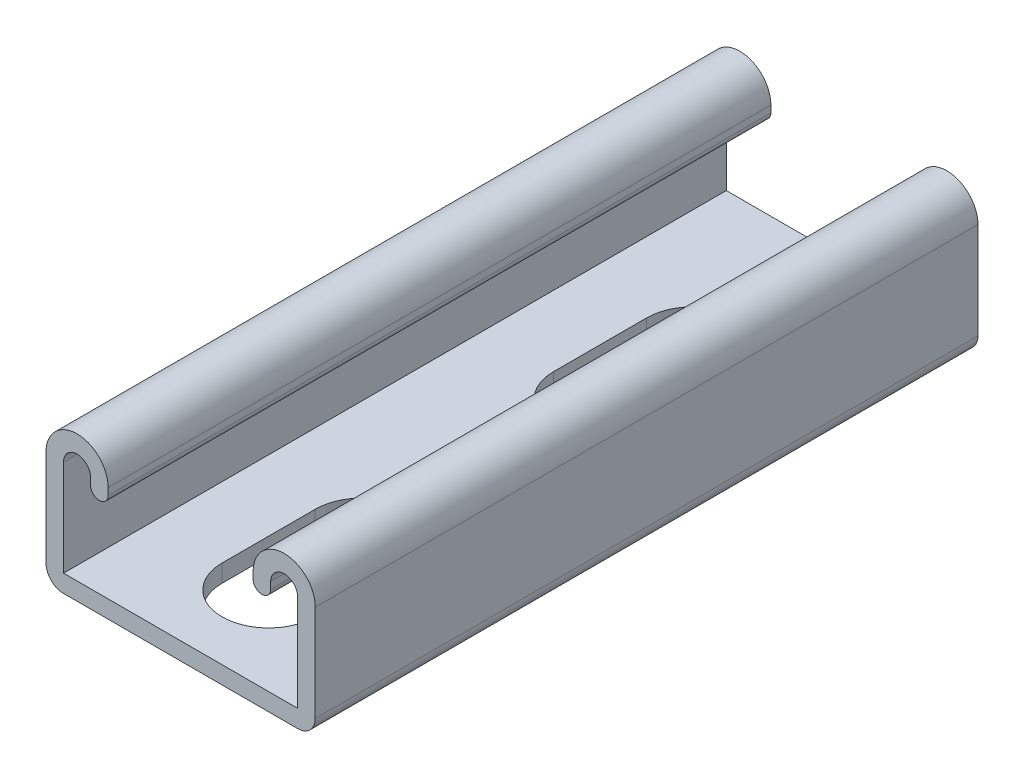
ISO-10303-21;
HEADER;
FILE_DESCRIPTION(('STEP AP214'),'2;1');
FILE_NAME('part.step','',(''),(''),'','','');
FILE_SCHEMA(('AUTOMOTIVE_DESIGN { 1 0 10303 214 1 1 1 1 }'));
ENDSEC;
DATA;
#1=APPLICATION_CONTEXT('core data for automotive mechanical design processes');
#2=APPLICATION_PROTOCOL_DEFINITION('international standard','automotive_design',2000,#1);
#3=PRODUCT_CONTEXT('',#1,'mechanical');
#4=PRODUCT('Part','Part','',(#3));
#5=PRODUCT_RELATED_PRODUCT_CATEGORY('part','',(#4));
#6=PRODUCT_DEFINITION_FORMATION('','',#4);
#7=PRODUCT_DEFINITION_CONTEXT('part definition',#1,'design');
#8=PRODUCT_DEFINITION('design','',#6,#7);
#9=PRODUCT_DEFINITION_SHAPE('','',#8);
#10=(LENGTH_UNIT() NAMED_UNIT(*) SI_UNIT(.MILLI.,.METRE.));
#11=(NAMED_UNIT(*) PLANE_ANGLE_UNIT() SI_UNIT($,.RADIAN.));
#12=(NAMED_UNIT(*) SI_UNIT($,.STERADIAN.) SOLID_ANGLE_UNIT());
#13=UNCERTAINTY_MEASURE_WITH_UNIT(LENGTH_MEASURE(1.E-05),#10,'distance_accuracy_value','');
#14=(GEOMETRIC_REPRESENTATION_CONTEXT(3) GLOBAL_UNCERTAINTY_ASSIGNED_CONTEXT((#13)) GLOBAL_UNIT_ASSIGNED_CONTEXT((#10,
#11,#12)) REPRESENTATION_CONTEXT('',''));
#15=CARTESIAN_POINT('',(0.,0.,0.));
#16=DIRECTION('',(0.,0.,1.));
#17=DIRECTION('',(1.,0.,0.));
#18=AXIS2_PLACEMENT_3D('',#15,#16,#17);
#19=CARTESIAN_POINT('',(-15.875,8.3693,101.6));
#20=DIRECTION('',(0.,0.,-1.));
#21=DIRECTION('',(-1.,0.,0.));
#22=AXIS2_PLACEMENT_3D('',#19,#20,#21);
#23=CYLINDRICAL_SURFACE('',#22,4.7625);
#24=CARTESIAN_POINT('',(-15.875,8.3693,0.));
#25=DIRECTION('',(0.,0.,1.));
#26=DIRECTION('',(-1.,0.,0.));
#27=AXIS2_PLACEMENT_3D('',#24,#25,#26);
#28=CIRCLE('',#27,4.7625);
#29=CARTESIAN_POINT('',(-11.1125,8.3693,0.));
#30=VERTEX_POINT('',#29);
#31=CARTESIAN_POINT('',(-20.6375,8.3693,0.));
#32=VERTEX_POINT('',#31);
#33=EDGE_CURVE('E253',#30,#32,#28,.T.);
#34=ORIENTED_EDGE('',*,*,#33,.T.);
#35=DIRECTION('',(0.,0.,-1.));
#36=VECTOR('',#35,1.);
#37=CARTESIAN_POINT('',(-20.6375,8.3693,101.6));
#38=LINE('',#37,#36);
#39=CARTESIAN_POINT('',(-20.6375,8.3693,101.6));
#40=VERTEX_POINT('',#39);
#41=EDGE_CURVE('E384',#40,#32,#38,.T.);
#42=ORIENTED_EDGE('',*,*,#41,.F.);
#43=CARTESIAN_POINT('',(-15.875,8.3693,101.6));
#44=DIRECTION('',(0.,0.,1.));
#45=DIRECTION('',(-1.,0.,0.));
#46=AXIS2_PLACEMENT_3D('',#43,#44,#45);
#47=CIRCLE('',#46,4.7625);
#48=CARTESIAN_POINT('',(-11.1125,8.3693,101.6));
#49=VERTEX_POINT('',#48);
#50=EDGE_CURVE('E260',#49,#40,#47,.T.);
#51=ORIENTED_EDGE('',*,*,#50,.F.);
#52=DIRECTION('',(0.,0.,-1.));
#53=VECTOR('',#52,1.);
#54=CARTESIAN_POINT('',(-11.1125,8.3693,101.6));
#55=LINE('',#54,#53);
#56=EDGE_CURVE('E298',#49,#30,#55,.T.);
#57=ORIENTED_EDGE('',*,*,#56,.T.);
#58=EDGE_LOOP('',(#34,#42,#51,#57));
#59=FACE_BOUND('',#58,.T.);
#60=ADVANCED_FACE('F32',(#59),#23,.T.);
#61=CARTESIAN_POINT('',(-20.6375,8.3693,101.6));
#62=DIRECTION('',(1.,0.,0.));
#63=DIRECTION('',(0.,1.,0.));
#64=AXIS2_PLACEMENT_3D('',#61,#62,#63);
#65=PLANE('',#64);
#66=DIRECTION('',(0.,-1.,0.));
#67=VECTOR('',#66,1.);
#68=CARTESIAN_POINT('',(-20.6375,8.3693,0.));
#69=LINE('',#68,#67);
#70=CARTESIAN_POINT('',(-20.6375,-6.4008,0.));
#71=VERTEX_POINT('',#70);
#72=EDGE_CURVE('E301',#32,#71,#69,.T.);
#73=ORIENTED_EDGE('',*,*,#72,.T.);
#74=DIRECTION('',(0.,0.,-1.));
#75=VECTOR('',#74,1.);
#76=CARTESIAN_POINT('',(-20.6375,-6.4008,101.6));
#77=LINE('',#76,#75);
#78=CARTESIAN_POINT('',(-20.6375,-6.4008,101.6));
#79=VERTEX_POINT('',#78);
#80=EDGE_CURVE('E381',#79,#71,#77,.T.);
#81=ORIENTED_EDGE('',*,*,#80,.F.);
#82=DIRECTION('',(0.,-1.,0.));
#83=VECTOR('',#82,1.);
#84=CARTESIAN_POINT('',(-20.6375,8.3693,101.6));
#85=LINE('',#84,#83);
#86=EDGE_CURVE('E263',#40,#79,#85,.T.);
#87=ORIENTED_EDGE('',*,*,#86,.F.);
#88=ORIENTED_EDGE('',*,*,#41,.T.);
#89=EDGE_LOOP('',(#73,#81,#87,#88));
#90=FACE_BOUND('',#89,.T.);
#91=ADVANCED_FACE('F425',(#90),#65,.F.);
#92=CARTESIAN_POINT('',(-17.9451,-6.4008,101.6));
#93=DIRECTION('',(0.,0.,-1.));
#94=DIRECTION('',(-1.,0.,0.));
#95=AXIS2_PLACEMENT_3D('',#92,#93,#94);
#96=CYLINDRICAL_SURFACE('',#95,2.6924);
#97=CARTESIAN_POINT('',(-17.9451,-6.4008,0.));
#98=DIRECTION('',(0.,0.,1.));
#99=DIRECTION('',(-1.,0.,0.));
#100=AXIS2_PLACEMENT_3D('',#97,#98,#99);
#101=CIRCLE('',#100,2.6924);
#102=CARTESIAN_POINT('',(-17.9451,-9.0932,0.));
#103=VERTEX_POINT('',#102);
#104=EDGE_CURVE('E303',#71,#103,#101,.T.);
#105=ORIENTED_EDGE('',*,*,#104,.T.);
#106=DIRECTION('',(0.,0.,-1.));
#107=VECTOR('',#106,1.);
#108=CARTESIAN_POINT('',(-17.9451,-9.0932,101.6));
#109=LINE('',#108,#107);
#110=CARTESIAN_POINT('',(-17.9451,-9.0932,101.6));
#111=VERTEX_POINT('',#110);
#112=EDGE_CURVE('E378',#111,#103,#109,.T.);
#113=ORIENTED_EDGE('',*,*,#112,.F.);
#114=CARTESIAN_POINT('',(-17.9451,-6.4008,101.6));
#115=DIRECTION('',(0.,0.,1.));
#116=DIRECTION('',(-1.,0.,0.));
#117=AXIS2_PLACEMENT_3D('',#114,#115,#116);
#118=CIRCLE('',#117,2.6924);
#119=EDGE_CURVE('E266',#79,#111,#118,.T.);
#120=ORIENTED_EDGE('',*,*,#119,.F.);
#121=ORIENTED_EDGE('',*,*,#80,.T.);
#122=EDGE_LOOP('',(#105,#113,#120,#121));
#123=FACE_BOUND('',#122,.T.);
#124=ADVANCED_FACE('F430',(#123),#96,.T.);
#125=CARTESIAN_POINT('',(-17.9451,-9.0932,101.6));
#126=DIRECTION('',(0.,1.,0.));
#127=DIRECTION('',(0.,0.,1.));
#128=AXIS2_PLACEMENT_3D('',#125,#126,#127);
#129=PLANE('',#128);
#130=DIRECTION('',(0.,0.,-1.));
#131=VECTOR('',#130,1.);
#132=CARTESIAN_POINT('',(-7.14375,-9.09319999999525,73.81875));
#133=LINE('',#132,#131);
#134=CARTESIAN_POINT('',(-7.14375,-9.0932,88.10625));
#135=VERTEX_POINT('',#134);
#136=CARTESIAN_POINT('',(-7.14375,-9.09319999999525,73.81875));
#137=VERTEX_POINT('',#136);
#138=EDGE_CURVE('E206',#135,#137,#133,.T.);
#139=ORIENTED_EDGE('',*,*,#138,.F.);
#140=CARTESIAN_POINT('',(0.,-9.09319999999525,88.10625));
#141=DIRECTION('',(0.,-1.,0.));
#142=DIRECTION('',(0.,0.,-1.));
#143=AXIS2_PLACEMENT_3D('',#140,#141,#142);
#144=CIRCLE('',#143,7.14375);
#145=CARTESIAN_POINT('',(7.14375,-9.09319999999525,88.10625));
#146=VERTEX_POINT('',#145);
#147=EDGE_CURVE('E46',#146,#135,#144,.T.);
#148=ORIENTED_EDGE('',*,*,#147,.F.);
#149=DIRECTION('',(0.,0.,1.));
#150=VECTOR('',#149,1.);
#151=CARTESIAN_POINT('',(7.14375,-9.09319999999525,88.10625));
#152=LINE('',#151,#150);
#153=CARTESIAN_POINT('',(7.14375,-9.09319999999525,73.81875));
#154=VERTEX_POINT('',#153);
#155=EDGE_CURVE('E222',#154,#146,#152,.T.);
#156=ORIENTED_EDGE('',*,*,#155,.F.);
#157=CARTESIAN_POINT('',(0.,-9.09319999999525,73.81875));
#158=DIRECTION('',(0.,-1.,0.));
#159=DIRECTION('',(0.,0.,-1.));
#160=AXIS2_PLACEMENT_3D('',#157,#158,#159);
#161=CIRCLE('',#160,7.14375);
#162=EDGE_CURVE('E216',#137,#154,#161,.T.);
#163=ORIENTED_EDGE('',*,*,#162,.F.);
#164=EDGE_LOOP('',(#139,#148,#156,#163));
#165=FACE_BOUND('',#164,.T.);
#166=DIRECTION('',(0.,0.,-1.));
#167=VECTOR('',#166,1.);
#168=CARTESIAN_POINT('',(-7.14375,-9.09319999999525,23.01875));
#169=LINE('',#168,#167);
#170=CARTESIAN_POINT('',(-7.14375,-9.0932,37.30625));
#171=VERTEX_POINT('',#170);
#172=CARTESIAN_POINT('',(-7.14375,-9.09319999999525,23.01875));
#173=VERTEX_POINT('',#172);
#174=EDGE_CURVE('E241',#171,#173,#169,.T.);
#175=ORIENTED_EDGE('',*,*,#174,.F.);
#176=CARTESIAN_POINT('',(0.,-9.09319999999525,37.30625));
#177=DIRECTION('',(0.,-1.,0.));
#178=DIRECTION('',(0.,0.,-1.));
#179=AXIS2_PLACEMENT_3D('',#176,#177,#178);
#180=CIRCLE('',#179,7.14375);
#181=CARTESIAN_POINT('',(7.14375,-9.09319999999525,37.30625));
#182=VERTEX_POINT('',#181);
#183=EDGE_CURVE('E239',#182,#171,#180,.T.);
#184=ORIENTED_EDGE('',*,*,#183,.F.);
#185=DIRECTION('',(0.,0.,1.));
#186=VECTOR('',#185,1.);
#187=CARTESIAN_POINT('',(7.14375,-9.09319999999525,37.30625));
#188=LINE('',#187,#186);
#189=CARTESIAN_POINT('',(7.14375,-9.09319999999525,23.01875));
#190=VERTEX_POINT('',#189);
#191=EDGE_CURVE('E247',#190,#182,#188,.T.);
#192=ORIENTED_EDGE('',*,*,#191,.F.);
#193=CARTESIAN_POINT('',(0.,-9.09319999999525,23.01875));
#194=DIRECTION('',(0.,-1.,0.));
#195=DIRECTION('',(0.,0.,-1.));
#196=AXIS2_PLACEMENT_3D('',#193,#194,#195);
#197=CIRCLE('',#196,7.14375);
#198=EDGE_CURVE('E244',#173,#190,#197,.T.);
#199=ORIENTED_EDGE('',*,*,#198,.F.);
#200=EDGE_LOOP('',(#175,#184,#192,#199));
#201=FACE_BOUND('',#200,.T.);
#202=DIRECTION('',(1.,0.,0.));
#203=VECTOR('',#202,1.);
#204=CARTESIAN_POINT('',(-17.9451,-9.0932,0.));
#205=LINE('',#204,#203);
#206=CARTESIAN_POINT('',(17.9451,-9.0932,0.));
#207=VERTEX_POINT('',#206);
#208=EDGE_CURVE('E305',#103,#207,#205,.T.);
#209=ORIENTED_EDGE('',*,*,#208,.T.);
#210=DIRECTION('',(0.,0.,-1.));
#211=VECTOR('',#210,1.);
#212=CARTESIAN_POINT('',(17.9451,-9.0932,101.6));
#213=LINE('',#212,#211);
#214=CARTESIAN_POINT('',(17.9451,-9.0932,101.6));
#215=VERTEX_POINT('',#214);
#216=EDGE_CURVE('E375',#215,#207,#213,.T.);
#217=ORIENTED_EDGE('',*,*,#216,.F.);
#218=DIRECTION('',(1.,0.,0.));
#219=VECTOR('',#218,1.);
#220=CARTESIAN_POINT('',(-17.9451,-9.0932,101.6));
#221=LINE('',#220,#219);
#222=EDGE_CURVE('E268',#111,#215,#221,.T.);
#223=ORIENTED_EDGE('',*,*,#222,.F.);
#224=ORIENTED_EDGE('',*,*,#112,.T.);
#225=EDGE_LOOP('',(#209,#217,#223,#224));
#226=FACE_BOUND('',#225,.T.);
#227=ADVANCED_FACE('F220',(#165,#201,#226),#129,.F.);
#228=CARTESIAN_POINT('',(17.9451,-6.4008,101.6));
#229=DIRECTION('',(0.,0.,-1.));
#230=DIRECTION('',(-1.,0.,0.));
#231=AXIS2_PLACEMENT_3D('',#228,#229,#230);
#232=CYLINDRICAL_SURFACE('',#231,2.6924);
#233=CARTESIAN_POINT('',(17.9451,-6.4008,0.));
#234=DIRECTION('',(0.,0.,1.));
#235=DIRECTION('',(1.,0.,0.));
#236=AXIS2_PLACEMENT_3D('',#233,#234,#235);
#237=CIRCLE('',#236,2.6924);
#238=CARTESIAN_POINT('',(20.6375,-6.4008,0.));
#239=VERTEX_POINT('',#238);
#240=EDGE_CURVE('E307',#207,#239,#237,.T.);
#241=ORIENTED_EDGE('',*,*,#240,.T.);
#242=DIRECTION('',(0.,0.,-1.));
#243=VECTOR('',#242,1.);
#244=CARTESIAN_POINT('',(20.6375,-6.4008,101.6));
#245=LINE('',#244,#243);
#246=CARTESIAN_POINT('',(20.6375,-6.4008,101.6));
#247=VERTEX_POINT('',#246);
#248=EDGE_CURVE('E372',#247,#239,#245,.T.);
#249=ORIENTED_EDGE('',*,*,#248,.F.);
#250=CARTESIAN_POINT('',(17.9451,-6.4008,101.6));
#251=DIRECTION('',(0.,0.,1.));
#252=DIRECTION('',(1.,0.,0.));
#253=AXIS2_PLACEMENT_3D('',#250,#251,#252);
#254=CIRCLE('',#253,2.6924);
#255=EDGE_CURVE('E270',#215,#247,#254,.T.);
#256=ORIENTED_EDGE('',*,*,#255,.F.);
#257=ORIENTED_EDGE('',*,*,#216,.T.);
#258=EDGE_LOOP('',(#241,#249,#256,#257));
#259=FACE_BOUND('',#258,.T.);
#260=ADVANCED_FACE('F510',(#259),#232,.T.);
#261=CARTESIAN_POINT('',(20.6375,-6.4008,101.6));
#262=DIRECTION('',(-1.,0.,0.));
#263=DIRECTION('',(0.,-1.,0.));
#264=AXIS2_PLACEMENT_3D('',#261,#262,#263);
#265=PLANE('',#264);
#266=DIRECTION('',(0.,1.,0.));
#267=VECTOR('',#266,1.);
#268=CARTESIAN_POINT('',(20.6375,-6.4008,0.));
#269=LINE('',#268,#267);
#270=CARTESIAN_POINT('',(20.6375,8.3693,0.));
#271=VERTEX_POINT('',#270);
#272=EDGE_CURVE('E309',#239,#271,#269,.T.);
#273=ORIENTED_EDGE('',*,*,#272,.T.);
#274=DIRECTION('',(0.,0.,-1.));
#275=VECTOR('',#274,1.);
#276=CARTESIAN_POINT('',(20.6375,8.3693,101.6));
#277=LINE('',#276,#275);
#278=CARTESIAN_POINT('',(20.6375,8.3693,101.6));
#279=VERTEX_POINT('',#278);
#280=EDGE_CURVE('E369',#279,#271,#277,.T.);
#281=ORIENTED_EDGE('',*,*,#280,.F.);
#282=DIRECTION('',(0.,1.,0.));
#283=VECTOR('',#282,1.);
#284=CARTESIAN_POINT('',(20.6375,-6.4008,101.6));
#285=LINE('',#284,#283);
#286=EDGE_CURVE('E272',#247,#279,#285,.T.);
#287=ORIENTED_EDGE('',*,*,#286,.F.);
#288=ORIENTED_EDGE('',*,*,#248,.T.);
#289=EDGE_LOOP('',(#273,#281,#287,#288));
#290=FACE_BOUND('',#289,.T.);
#291=ADVANCED_FACE('F506',(#290),#265,.F.);
#292=CARTESIAN_POINT('',(15.875,8.3693,101.6));
#293=DIRECTION('',(0.,0.,-1.));
#294=DIRECTION('',(-1.,0.,0.));
#295=AXIS2_PLACEMENT_3D('',#292,#293,#294);
#296=CYLINDRICAL_SURFACE('',#295,4.7625);
#297=CARTESIAN_POINT('',(15.875,8.3693,0.));
#298=DIRECTION('',(0.,0.,1.));
#299=DIRECTION('',(1.,0.,0.));
#300=AXIS2_PLACEMENT_3D('',#297,#298,#299);
#301=CIRCLE('',#300,4.7625);
#302=CARTESIAN_POINT('',(11.1125,8.3693,0.));
#303=VERTEX_POINT('',#302);
#304=EDGE_CURVE('E311',#271,#303,#301,.T.);
#305=ORIENTED_EDGE('',*,*,#304,.T.);
#306=DIRECTION('',(0.,0.,-1.));
#307=VECTOR('',#306,1.);
#308=CARTESIAN_POINT('',(11.1125,8.3693,101.6));
#309=LINE('',#308,#307);
#310=CARTESIAN_POINT('',(11.1125,8.3693,101.6));
#311=VERTEX_POINT('',#310);
#312=EDGE_CURVE('E366',#311,#303,#309,.T.);
#313=ORIENTED_EDGE('',*,*,#312,.F.);
#314=CARTESIAN_POINT('',(15.875,8.3693,101.6));
#315=DIRECTION('',(0.,0.,1.));
#316=DIRECTION('',(1.,0.,0.));
#317=AXIS2_PLACEMENT_3D('',#314,#315,#316);
#318=CIRCLE('',#317,4.7625);
#319=EDGE_CURVE('E274',#279,#311,#318,.T.);
#320=ORIENTED_EDGE('',*,*,#319,.F.);
#321=ORIENTED_EDGE('',*,*,#280,.T.);
#322=EDGE_LOOP('',(#305,#313,#320,#321));
#323=FACE_BOUND('',#322,.T.);
#324=ADVANCED_FACE('F501',(#323),#296,.T.);
#325=CARTESIAN_POINT('',(11.1125,8.3693,101.6));
#326=DIRECTION('',(1.,0.,0.));
#327=DIRECTION('',(0.,0.,-1.));
#328=AXIS2_PLACEMENT_3D('',#325,#326,#327);
#329=PLANE('',#328);
#330=DIRECTION('',(0.,-1.,0.));
#331=VECTOR('',#330,1.);
#332=CARTESIAN_POINT('',(11.1125,8.3693,0.));
#333=LINE('',#332,#331);
#334=CARTESIAN_POINT('',(11.1125,7.33425,0.));
#335=VERTEX_POINT('',#334);
#336=EDGE_CURVE('E313',#303,#335,#333,.T.);
#337=ORIENTED_EDGE('',*,*,#336,.T.);
#338=DIRECTION('',(0.,0.,-1.));
#339=VECTOR('',#338,1.);
#340=CARTESIAN_POINT('',(11.1125,7.33425,101.6));
#341=LINE('',#340,#339);
#342=CARTESIAN_POINT('',(11.1125,7.33425,101.6));
#343=VERTEX_POINT('',#342);
#344=EDGE_CURVE('E363',#343,#335,#341,.T.);
#345=ORIENTED_EDGE('',*,*,#344,.F.);
#346=DIRECTION('',(0.,-1.,0.));
#347=VECTOR('',#346,1.);
#348=CARTESIAN_POINT('',(11.1125,8.3693,101.6));
#349=LINE('',#348,#347);
#350=EDGE_CURVE('E276',#311,#343,#349,.T.);
#351=ORIENTED_EDGE('',*,*,#350,.F.);
#352=ORIENTED_EDGE('',*,*,#312,.T.);
#353=EDGE_LOOP('',(#337,#345,#351,#352));
#354=FACE_BOUND('',#353,.T.);
#355=ADVANCED_FACE('F495',(#354),#329,.F.);
#356=CARTESIAN_POINT('',(12.4587,7.33425,101.6));
#357=DIRECTION('',(0.,0.,-1.));
#358=DIRECTION('',(-1.,0.,0.));
#359=AXIS2_PLACEMENT_3D('',#356,#357,#358);
#360=CYLINDRICAL_SURFACE('',#359,1.3462);
#361=CARTESIAN_POINT('',(12.4587,7.33425,0.));
#362=DIRECTION('',(0.,0.,1.));
#363=DIRECTION('',(1.,0.,0.));
#364=AXIS2_PLACEMENT_3D('',#361,#362,#363);
#365=CIRCLE('',#364,1.3462);
#366=CARTESIAN_POINT('',(13.8049,7.33425,0.));
#367=VERTEX_POINT('',#366);
#368=EDGE_CURVE('E315',#335,#367,#365,.T.);
#369=ORIENTED_EDGE('',*,*,#368,.T.);
#370=DIRECTION('',(0.,0.,-1.));
#371=VECTOR('',#370,1.);
#372=CARTESIAN_POINT('',(13.8049,7.33425,101.6));
#373=LINE('',#372,#371);
#374=CARTESIAN_POINT('',(13.8049,7.33425,101.6));
#375=VERTEX_POINT('',#374);
#376=EDGE_CURVE('E360',#375,#367,#373,.T.);
#377=ORIENTED_EDGE('',*,*,#376,.F.);
#378=CARTESIAN_POINT('',(12.4587,7.33425,101.6));
#379=DIRECTION('',(0.,0.,1.));
#380=DIRECTION('',(1.,0.,0.));
#381=AXIS2_PLACEMENT_3D('',#378,#379,#380);
#382=CIRCLE('',#381,1.3462);
#383=EDGE_CURVE('E278',#343,#375,#382,.T.);
#384=ORIENTED_EDGE('',*,*,#383,.F.);
#385=ORIENTED_EDGE('',*,*,#344,.T.);
#386=EDGE_LOOP('',(#369,#377,#384,#385));
#387=FACE_BOUND('',#386,.T.);
#388=ADVANCED_FACE('F491',(#387),#360,.T.);
#389=CARTESIAN_POINT('',(13.8049,8.3693,101.6));
#390=DIRECTION('',(-1.,0.,0.));
#391=DIRECTION('',(0.,0.,1.));
#392=AXIS2_PLACEMENT_3D('',#389,#390,#391);
#393=PLANE('',#392);
#394=DIRECTION('',(0.,1.,0.));
#395=VECTOR('',#394,1.);
#396=CARTESIAN_POINT('',(13.8049,8.3693,0.));
#397=LINE('',#396,#395);
#398=CARTESIAN_POINT('',(13.8049,8.3693,0.));
#399=VERTEX_POINT('',#398);
#400=EDGE_CURVE('E317',#367,#399,#397,.T.);
#401=ORIENTED_EDGE('',*,*,#400,.T.);
#402=DIRECTION('',(0.,0.,-1.));
#403=VECTOR('',#402,1.);
#404=CARTESIAN_POINT('',(13.8049,8.3693,101.6));
#405=LINE('',#404,#403);
#406=CARTESIAN_POINT('',(13.8049,8.3693,101.6));
#407=VERTEX_POINT('',#406);
#408=EDGE_CURVE('E357',#407,#399,#405,.T.);
#409=ORIENTED_EDGE('',*,*,#408,.F.);
#410=DIRECTION('',(0.,1.,0.));
#411=VECTOR('',#410,1.);
#412=CARTESIAN_POINT('',(13.8049,8.3693,101.6));
#413=LINE('',#412,#411);
#414=EDGE_CURVE('E280',#375,#407,#413,.T.);
#415=ORIENTED_EDGE('',*,*,#414,.F.);
#416=ORIENTED_EDGE('',*,*,#376,.T.);
#417=EDGE_LOOP('',(#401,#409,#415,#416));
#418=FACE_BOUND('',#417,.T.);
#419=ADVANCED_FACE('F486',(#418),#393,.F.);
#420=CARTESIAN_POINT('',(15.875,8.3693,101.6));
#421=DIRECTION('',(0.,0.,-1.));
#422=DIRECTION('',(-1.,0.,0.));
#423=AXIS2_PLACEMENT_3D('',#420,#421,#422);
#424=CYLINDRICAL_SURFACE('',#423,2.0701);
#425=CARTESIAN_POINT('',(15.875,8.3693,0.));
#426=DIRECTION('',(0.,0.,-1.));
#427=DIRECTION('',(1.,0.,0.));
#428=AXIS2_PLACEMENT_3D('',#425,#426,#427);
#429=CIRCLE('',#428,2.0701);
#430=CARTESIAN_POINT('',(17.9451,8.3693,0.));
#431=VERTEX_POINT('',#430);
#432=EDGE_CURVE('E319',#399,#431,#429,.T.);
#433=ORIENTED_EDGE('',*,*,#432,.T.);
#434=DIRECTION('',(0.,0.,-1.));
#435=VECTOR('',#434,1.);
#436=CARTESIAN_POINT('',(17.9451,8.3693,101.6));
#437=LINE('',#436,#435);
#438=CARTESIAN_POINT('',(17.9451,8.3693,101.6));
#439=VERTEX_POINT('',#438);
#440=EDGE_CURVE('E354',#439,#431,#437,.T.);
#441=ORIENTED_EDGE('',*,*,#440,.F.);
#442=CARTESIAN_POINT('',(15.875,8.3693,101.6));
#443=DIRECTION('',(0.,0.,-1.));
#444=DIRECTION('',(1.,0.,0.));
#445=AXIS2_PLACEMENT_3D('',#442,#443,#444);
#446=CIRCLE('',#445,2.0701);
#447=EDGE_CURVE('E282',#407,#439,#446,.T.);
#448=ORIENTED_EDGE('',*,*,#447,.F.);
#449=ORIENTED_EDGE('',*,*,#408,.T.);
#450=EDGE_LOOP('',(#433,#441,#448,#449));
#451=FACE_BOUND('',#450,.T.);
#452=ADVANCED_FACE('F480',(#451),#424,.F.);
#453=CARTESIAN_POINT('',(17.9451,-6.4008,101.6));
#454=DIRECTION('',(1.,0.,0.));
#455=DIRECTION('',(0.,1.,0.));
#456=AXIS2_PLACEMENT_3D('',#453,#454,#455);
#457=PLANE('',#456);
#458=DIRECTION('',(0.,-1.,0.));
#459=VECTOR('',#458,1.);
#460=CARTESIAN_POINT('',(17.9451,-6.4008,0.));
#461=LINE('',#460,#459);
#462=CARTESIAN_POINT('',(17.9451,-6.4008,0.));
#463=VERTEX_POINT('',#462);
#464=EDGE_CURVE('E321',#431,#463,#461,.T.);
#465=ORIENTED_EDGE('',*,*,#464,.T.);
#466=DIRECTION('',(0.,0.,-1.));
#467=VECTOR('',#466,1.);
#468=CARTESIAN_POINT('',(17.9451,-6.4008,101.6));
#469=LINE('',#468,#467);
#470=CARTESIAN_POINT('',(17.9451,-6.4008,101.6));
#471=VERTEX_POINT('',#470);
#472=EDGE_CURVE('E351',#471,#463,#469,.T.);
#473=ORIENTED_EDGE('',*,*,#472,.F.);
#474=DIRECTION('',(0.,-1.,0.));
#475=VECTOR('',#474,1.);
#476=CARTESIAN_POINT('',(17.9451,-6.4008,101.6));
#477=LINE('',#476,#475);
#478=EDGE_CURVE('E284',#439,#471,#477,.T.);
#479=ORIENTED_EDGE('',*,*,#478,.F.);
#480=ORIENTED_EDGE('',*,*,#440,.T.);
#481=EDGE_LOOP('',(#465,#473,#479,#480));
#482=FACE_BOUND('',#481,.T.);
#483=ADVANCED_FACE('F476',(#482),#457,.F.);
#484=CARTESIAN_POINT('',(-17.9451,-6.4008,101.6));
#485=DIRECTION('',(0.,-1.,0.));
#486=DIRECTION('',(0.,0.,-1.));
#487=AXIS2_PLACEMENT_3D('',#484,#485,#486);
#488=PLANE('',#487);
#489=DIRECTION('',(0.,0.,1.));
#490=VECTOR('',#489,1.);
#491=CARTESIAN_POINT('',(7.14374999999999,-6.4008,152.4));
#492=LINE('',#491,#490);
#493=CARTESIAN_POINT('',(7.14375,-6.4008,73.81875));
#494=VERTEX_POINT('',#493);
#495=CARTESIAN_POINT('',(7.14375,-6.4008,88.10625));
#496=VERTEX_POINT('',#495);
#497=EDGE_CURVE('E232',#494,#496,#492,.T.);
#498=ORIENTED_EDGE('',*,*,#497,.T.);
#499=CARTESIAN_POINT('',(0.,-6.4008,88.10625));
#500=DIRECTION('',(0.,-1.,0.));
#501=DIRECTION('',(0.,0.,-1.));
#502=AXIS2_PLACEMENT_3D('',#499,#500,#501);
#503=CIRCLE('',#502,7.14375);
#504=CARTESIAN_POINT('',(-7.14375,-6.4008,88.10625));
#505=VERTEX_POINT('',#504);
#506=EDGE_CURVE('E236',#496,#505,#503,.T.);
#507=ORIENTED_EDGE('',*,*,#506,.T.);
#508=DIRECTION('',(0.,0.,-1.));
#509=VECTOR('',#508,1.);
#510=CARTESIAN_POINT('',(-7.14375,-6.4008,152.4));
#511=LINE('',#510,#509);
#512=CARTESIAN_POINT('',(-7.14375,-6.4008,73.81875));
#513=VERTEX_POINT('',#512);
#514=EDGE_CURVE('E213',#505,#513,#511,.T.);
#515=ORIENTED_EDGE('',*,*,#514,.T.);
#516=CARTESIAN_POINT('',(0.,-6.4008,73.81875));
#517=DIRECTION('',(0.,-1.,0.));
#518=DIRECTION('',(0.,0.,-1.));
#519=AXIS2_PLACEMENT_3D('',#516,#517,#518);
#520=CIRCLE('',#519,7.14375);
#521=EDGE_CURVE('E54',#513,#494,#520,.T.);
#522=ORIENTED_EDGE('',*,*,#521,.T.);
#523=EDGE_LOOP('',(#498,#507,#515,#522));
#524=FACE_BOUND('',#523,.T.);
#525=DIRECTION('',(0.,0.,1.));
#526=VECTOR('',#525,1.);
#527=CARTESIAN_POINT('',(7.14374999999999,-6.4008,101.6));
#528=LINE('',#527,#526);
#529=CARTESIAN_POINT('',(7.14375,-6.4008,23.01875));
#530=VERTEX_POINT('',#529);
#531=CARTESIAN_POINT('',(7.14375,-6.4008,37.30625));
#532=VERTEX_POINT('',#531);
#533=EDGE_CURVE('E39',#530,#532,#528,.T.);
#534=ORIENTED_EDGE('',*,*,#533,.T.);
#535=CARTESIAN_POINT('',(0.,-6.4008,37.30625));
#536=DIRECTION('',(0.,-1.,0.));
#537=DIRECTION('',(0.,0.,-1.));
#538=AXIS2_PLACEMENT_3D('',#535,#536,#537);
#539=CIRCLE('',#538,7.14375);
#540=CARTESIAN_POINT('',(-7.14375,-6.4008,37.30625));
#541=VERTEX_POINT('',#540);
#542=EDGE_CURVE('E11',#532,#541,#539,.T.);
#543=ORIENTED_EDGE('',*,*,#542,.T.);
#544=DIRECTION('',(0.,0.,-1.));
#545=VECTOR('',#544,1.);
#546=CARTESIAN_POINT('',(-7.14375,-6.4008,101.6));
#547=LINE('',#546,#545);
#548=CARTESIAN_POINT('',(-7.14375,-6.4008,23.01875));
#549=VERTEX_POINT('',#548);
#550=EDGE_CURVE('E387',#541,#549,#547,.T.);
#551=ORIENTED_EDGE('',*,*,#550,.T.);
#552=CARTESIAN_POINT('',(0.,-6.4008,23.01875));
#553=DIRECTION('',(0.,-1.,0.));
#554=DIRECTION('',(0.,0.,-1.));
#555=AXIS2_PLACEMENT_3D('',#552,#553,#554);
#556=CIRCLE('',#555,7.14375);
#557=EDGE_CURVE('E390',#549,#530,#556,.T.);
#558=ORIENTED_EDGE('',*,*,#557,.T.);
#559=EDGE_LOOP('',(#534,#543,#551,#558));
#560=FACE_BOUND('',#559,.T.);
#561=DIRECTION('',(-1.,0.,0.));
#562=VECTOR('',#561,1.);
#563=CARTESIAN_POINT('',(-17.9451,-6.4008,0.));
#564=LINE('',#563,#562);
#565=CARTESIAN_POINT('',(-17.9451,-6.4008,0.));
#566=VERTEX_POINT('',#565);
#567=EDGE_CURVE('E323',#463,#566,#564,.T.);
#568=ORIENTED_EDGE('',*,*,#567,.T.);
#569=DIRECTION('',(0.,0.,-1.));
#570=VECTOR('',#569,1.);
#571=CARTESIAN_POINT('',(-17.9451,-6.4008,101.6));
#572=LINE('',#571,#570);
#573=CARTESIAN_POINT('',(-17.9451,-6.4008,101.6));
#574=VERTEX_POINT('',#573);
#575=EDGE_CURVE('E348',#574,#566,#572,.T.);
#576=ORIENTED_EDGE('',*,*,#575,.F.);
#577=DIRECTION('',(-1.,0.,0.));
#578=VECTOR('',#577,1.);
#579=CARTESIAN_POINT('',(-17.9451,-6.4008,101.6));
#580=LINE('',#579,#578);
#581=EDGE_CURVE('E286',#471,#574,#580,.T.);
#582=ORIENTED_EDGE('',*,*,#581,.F.);
#583=ORIENTED_EDGE('',*,*,#472,.T.);
#584=EDGE_LOOP('',(#568,#576,#582,#583));
#585=FACE_BOUND('',#584,.T.);
#586=ADVANCED_FACE('F394',(#524,#560,#585),#488,.F.);
#587=CARTESIAN_POINT('',(-17.9451,8.3693,101.6));
#588=DIRECTION('',(-1.,0.,0.));
#589=DIRECTION('',(0.,-1.,0.));
#590=AXIS2_PLACEMENT_3D('',#587,#588,#589);
#591=PLANE('',#590);
#592=DIRECTION('',(0.,1.,0.));
#593=VECTOR('',#592,1.);
#594=CARTESIAN_POINT('',(-17.9451,8.3693,0.));
#595=LINE('',#594,#593);
#596=CARTESIAN_POINT('',(-17.9451,8.3693,0.));
#597=VERTEX_POINT('',#596);
#598=EDGE_CURVE('E325',#566,#597,#595,.T.);
#599=ORIENTED_EDGE('',*,*,#598,.T.);
#600=DIRECTION('',(0.,0.,-1.));
#601=VECTOR('',#600,1.);
#602=CARTESIAN_POINT('',(-17.9451,8.3693,101.6));
#603=LINE('',#602,#601);
#604=CARTESIAN_POINT('',(-17.9451,8.3693,101.6));
#605=VERTEX_POINT('',#604);
#606=EDGE_CURVE('E345',#605,#597,#603,.T.);
#607=ORIENTED_EDGE('',*,*,#606,.F.);
#608=DIRECTION('',(0.,1.,0.));
#609=VECTOR('',#608,1.);
#610=CARTESIAN_POINT('',(-17.9451,8.3693,101.6));
#611=LINE('',#610,#609);
#612=EDGE_CURVE('E288',#574,#605,#611,.T.);
#613=ORIENTED_EDGE('',*,*,#612,.F.);
#614=ORIENTED_EDGE('',*,*,#575,.T.);
#615=EDGE_LOOP('',(#599,#607,#613,#614));
#616=FACE_BOUND('',#615,.T.);
#617=ADVANCED_FACE('F467',(#616),#591,.F.);
#618=CARTESIAN_POINT('',(-15.875,8.3693,101.6));
#619=DIRECTION('',(0.,0.,-1.));
#620=DIRECTION('',(-1.,0.,0.));
#621=AXIS2_PLACEMENT_3D('',#618,#619,#620);
#622=CYLINDRICAL_SURFACE('',#621,2.0701);
#623=CARTESIAN_POINT('',(-15.875,8.3693,0.));
#624=DIRECTION('',(0.,0.,-1.));
#625=DIRECTION('',(-1.,0.,0.));
#626=AXIS2_PLACEMENT_3D('',#623,#624,#625);
#627=CIRCLE('',#626,2.0701);
#628=CARTESIAN_POINT('',(-13.8049,8.3693,0.));
#629=VERTEX_POINT('',#628);
#630=EDGE_CURVE('E327',#597,#629,#627,.T.);
#631=ORIENTED_EDGE('',*,*,#630,.T.);
#632=DIRECTION('',(0.,0.,-1.));
#633=VECTOR('',#632,1.);
#634=CARTESIAN_POINT('',(-13.8049,8.3693,101.6));
#635=LINE('',#634,#633);
#636=CARTESIAN_POINT('',(-13.8049,8.3693,101.6));
#637=VERTEX_POINT('',#636);
#638=EDGE_CURVE('E342',#637,#629,#635,.T.);
#639=ORIENTED_EDGE('',*,*,#638,.F.);
#640=CARTESIAN_POINT('',(-15.875,8.3693,101.6));
#641=DIRECTION('',(0.,0.,-1.));
#642=DIRECTION('',(-1.,0.,0.));
#643=AXIS2_PLACEMENT_3D('',#640,#641,#642);
#644=CIRCLE('',#643,2.0701);
#645=EDGE_CURVE('E290',#605,#637,#644,.T.);
#646=ORIENTED_EDGE('',*,*,#645,.F.);
#647=ORIENTED_EDGE('',*,*,#606,.T.);
#648=EDGE_LOOP('',(#631,#639,#646,#647));
#649=FACE_BOUND('',#648,.T.);
#650=ADVANCED_FACE('F463',(#649),#622,.F.);
#651=CARTESIAN_POINT('',(-13.8049,8.3693,101.6));
#652=DIRECTION('',(1.,0.,0.));
#653=DIRECTION('',(0.,1.,0.));
#654=AXIS2_PLACEMENT_3D('',#651,#652,#653);
#655=PLANE('',#654);
#656=DIRECTION('',(0.,-1.,0.));
#657=VECTOR('',#656,1.);
#658=CARTESIAN_POINT('',(-13.8049,8.3693,0.));
#659=LINE('',#658,#657);
#660=CARTESIAN_POINT('',(-13.8049,7.33425,0.));
#661=VERTEX_POINT('',#660);
#662=EDGE_CURVE('E329',#629,#661,#659,.T.);
#663=ORIENTED_EDGE('',*,*,#662,.T.);
#664=DIRECTION('',(0.,0.,-1.));
#665=VECTOR('',#664,1.);
#666=CARTESIAN_POINT('',(-13.8049,7.33425,101.6));
#667=LINE('',#666,#665);
#668=CARTESIAN_POINT('',(-13.8049,7.33425,101.6));
#669=VERTEX_POINT('',#668);
#670=EDGE_CURVE('E339',#669,#661,#667,.T.);
#671=ORIENTED_EDGE('',*,*,#670,.F.);
#672=DIRECTION('',(0.,-1.,0.));
#673=VECTOR('',#672,1.);
#674=CARTESIAN_POINT('',(-13.8049,8.3693,101.6));
#675=LINE('',#674,#673);
#676=EDGE_CURVE('E292',#637,#669,#675,.T.);
#677=ORIENTED_EDGE('',*,*,#676,.F.);
#678=ORIENTED_EDGE('',*,*,#638,.T.);
#679=EDGE_LOOP('',(#663,#671,#677,#678));
#680=FACE_BOUND('',#679,.T.);
#681=ADVANCED_FACE('F458',(#680),#655,.F.);
#682=CARTESIAN_POINT('',(-12.4587,7.33425,101.6));
#683=DIRECTION('',(0.,0.,-1.));
#684=DIRECTION('',(-1.,0.,0.));
#685=AXIS2_PLACEMENT_3D('',#682,#683,#684);
#686=CYLINDRICAL_SURFACE('',#685,1.3462);
#687=CARTESIAN_POINT('',(-12.4587,7.33425,0.));
#688=DIRECTION('',(0.,0.,1.));
#689=DIRECTION('',(-1.,0.,0.));
#690=AXIS2_PLACEMENT_3D('',#687,#688,#689);
#691=CIRCLE('',#690,1.3462);
#692=CARTESIAN_POINT('',(-11.1125,7.33425,0.));
#693=VERTEX_POINT('',#692);
#694=EDGE_CURVE('E331',#661,#693,#691,.T.);
#695=ORIENTED_EDGE('',*,*,#694,.T.);
#696=DIRECTION('',(0.,0.,-1.));
#697=VECTOR('',#696,1.);
#698=CARTESIAN_POINT('',(-11.1125,7.33425,101.6));
#699=LINE('',#698,#697);
#700=CARTESIAN_POINT('',(-11.1125,7.33425,101.6));
#701=VERTEX_POINT('',#700);
#702=EDGE_CURVE('E336',#701,#693,#699,.T.);
#703=ORIENTED_EDGE('',*,*,#702,.F.);
#704=CARTESIAN_POINT('',(-12.4587,7.33425,101.6));
#705=DIRECTION('',(0.,0.,1.));
#706=DIRECTION('',(-1.,0.,0.));
#707=AXIS2_PLACEMENT_3D('',#704,#705,#706);
#708=CIRCLE('',#707,1.3462);
#709=EDGE_CURVE('E294',#669,#701,#708,.T.);
#710=ORIENTED_EDGE('',*,*,#709,.F.);
#711=ORIENTED_EDGE('',*,*,#670,.T.);
#712=EDGE_LOOP('',(#695,#703,#710,#711));
#713=FACE_BOUND('',#712,.T.);
#714=ADVANCED_FACE('F452',(#713),#686,.T.);
#715=CARTESIAN_POINT('',(-11.1125,8.3693,101.6));
#716=DIRECTION('',(-1.,0.,0.));
#717=DIRECTION('',(0.,0.,1.));
#718=AXIS2_PLACEMENT_3D('',#715,#716,#717);
#719=PLANE('',#718);
#720=DIRECTION('',(0.,1.,0.));
#721=VECTOR('',#720,1.);
#722=CARTESIAN_POINT('',(-11.1125,8.3693,0.));
#723=LINE('',#722,#721);
#724=EDGE_CURVE('E264',#693,#30,#723,.T.);
#725=ORIENTED_EDGE('',*,*,#724,.T.);
#726=ORIENTED_EDGE('',*,*,#56,.F.);
#727=DIRECTION('',(0.,1.,0.));
#728=VECTOR('',#727,1.);
#729=CARTESIAN_POINT('',(-11.1125,8.3693,101.6));
#730=LINE('',#729,#728);
#731=EDGE_CURVE('E296',#701,#49,#730,.T.);
#732=ORIENTED_EDGE('',*,*,#731,.F.);
#733=ORIENTED_EDGE('',*,*,#702,.T.);
#734=EDGE_LOOP('',(#725,#726,#732,#733));
#735=FACE_BOUND('',#734,.T.);
#736=ADVANCED_FACE('F450',(#735),#719,.F.);
#737=CARTESIAN_POINT('',(-15.875,8.3693,101.6));
#738=DIRECTION('',(0.,0.,-1.));
#739=DIRECTION('',(-1.,0.,0.));
#740=AXIS2_PLACEMENT_3D('',#737,#738,#739);
#741=PLANE('',#740);
#742=ORIENTED_EDGE('',*,*,#50,.T.);
#743=ORIENTED_EDGE('',*,*,#86,.T.);
#744=ORIENTED_EDGE('',*,*,#119,.T.);
#745=ORIENTED_EDGE('',*,*,#222,.T.);
#746=ORIENTED_EDGE('',*,*,#255,.T.);
#747=ORIENTED_EDGE('',*,*,#286,.T.);
#748=ORIENTED_EDGE('',*,*,#319,.T.);
#749=ORIENTED_EDGE('',*,*,#350,.T.);
#750=ORIENTED_EDGE('',*,*,#383,.T.);
#751=ORIENTED_EDGE('',*,*,#414,.T.);
#752=ORIENTED_EDGE('',*,*,#447,.T.);
#753=ORIENTED_EDGE('',*,*,#478,.T.);
#754=ORIENTED_EDGE('',*,*,#581,.T.);
#755=ORIENTED_EDGE('',*,*,#612,.T.);
#756=ORIENTED_EDGE('',*,*,#645,.T.);
#757=ORIENTED_EDGE('',*,*,#676,.T.);
#758=ORIENTED_EDGE('',*,*,#709,.T.);
#759=ORIENTED_EDGE('',*,*,#731,.T.);
#760=EDGE_LOOP('',(#742,#743,#744,#745,#746,#747,#748,#749,#750,#751,#752,#753,#754,#755,#756,
#757,#758,#759));
#761=FACE_BOUND('',#760,.T.);
#762=ADVANCED_FACE('F445',(#761),#741,.F.);
#763=CARTESIAN_POINT('',(-15.875,8.3693,0.));
#764=DIRECTION('',(0.,0.,-1.));
#765=DIRECTION('',(-1.,0.,0.));
#766=AXIS2_PLACEMENT_3D('',#763,#764,#765);
#767=PLANE('',#766);
#768=ORIENTED_EDGE('',*,*,#33,.F.);
#769=ORIENTED_EDGE('',*,*,#724,.F.);
#770=ORIENTED_EDGE('',*,*,#694,.F.);
#771=ORIENTED_EDGE('',*,*,#662,.F.);
#772=ORIENTED_EDGE('',*,*,#630,.F.);
#773=ORIENTED_EDGE('',*,*,#598,.F.);
#774=ORIENTED_EDGE('',*,*,#567,.F.);
#775=ORIENTED_EDGE('',*,*,#464,.F.);
#776=ORIENTED_EDGE('',*,*,#432,.F.);
#777=ORIENTED_EDGE('',*,*,#400,.F.);
#778=ORIENTED_EDGE('',*,*,#368,.F.);
#779=ORIENTED_EDGE('',*,*,#336,.F.);
#780=ORIENTED_EDGE('',*,*,#304,.F.);
#781=ORIENTED_EDGE('',*,*,#272,.F.);
#782=ORIENTED_EDGE('',*,*,#240,.F.);
#783=ORIENTED_EDGE('',*,*,#208,.F.);
#784=ORIENTED_EDGE('',*,*,#104,.F.);
#785=ORIENTED_EDGE('',*,*,#72,.F.);
#786=EDGE_LOOP('',(#768,#769,#770,#771,#772,#773,#774,#775,#776,#777,#778,#779,#780,#781,#782,
#783,#784,#785));
#787=FACE_BOUND('',#786,.T.);
#788=ADVANCED_FACE('F438',(#787),#767,.T.);
#789=CARTESIAN_POINT('',(0.,13.1318,37.30625));
#790=DIRECTION('',(0.,-1.,0.));
#791=DIRECTION('',(0.,0.,-1.));
#792=AXIS2_PLACEMENT_3D('',#789,#790,#791);
#793=CYLINDRICAL_SURFACE('',#792,7.14375);
#794=DIRECTION('',(0.,-1.,0.));
#795=VECTOR('',#794,1.);
#796=CARTESIAN_POINT('',(7.14375,13.1318,37.30625));
#797=LINE('',#796,#795);
#798=EDGE_CURVE('E251',#532,#182,#797,.T.);
#799=ORIENTED_EDGE('',*,*,#798,.T.);
#800=ORIENTED_EDGE('',*,*,#183,.T.);
#801=DIRECTION('',(0.,-1.,0.));
#802=VECTOR('',#801,1.);
#803=CARTESIAN_POINT('',(-7.14375,13.1318,37.30625));
#804=LINE('',#803,#802);
#805=EDGE_CURVE('E250',#541,#171,#804,.T.);
#806=ORIENTED_EDGE('',*,*,#805,.F.);
#807=ORIENTED_EDGE('',*,*,#542,.F.);
#808=EDGE_LOOP('',(#799,#800,#806,#807));
#809=FACE_BOUND('',#808,.T.);
#810=ADVANCED_FACE('F410',(#809),#793,.F.);
#811=CARTESIAN_POINT('',(7.14375,13.1318,37.30625));
#812=DIRECTION('',(1.,0.,0.));
#813=DIRECTION('',(0.,0.,-1.));
#814=AXIS2_PLACEMENT_3D('',#811,#812,#813);
#815=PLANE('',#814);
#816=DIRECTION('',(0.,-1.,0.));
#817=VECTOR('',#816,1.);
#818=CARTESIAN_POINT('',(7.14375,13.1318,23.01875));
#819=LINE('',#818,#817);
#820=EDGE_CURVE('E254',#530,#190,#819,.T.);
#821=ORIENTED_EDGE('',*,*,#820,.T.);
#822=ORIENTED_EDGE('',*,*,#191,.T.);
#823=ORIENTED_EDGE('',*,*,#798,.F.);
#824=ORIENTED_EDGE('',*,*,#533,.F.);
#825=EDGE_LOOP('',(#821,#822,#823,#824));
#826=FACE_BOUND('',#825,.T.);
#827=ADVANCED_FACE('F400',(#826),#815,.F.);
#828=CARTESIAN_POINT('',(0.,13.1318,23.01875));
#829=DIRECTION('',(0.,-1.,0.));
#830=DIRECTION('',(0.,0.,-1.));
#831=AXIS2_PLACEMENT_3D('',#828,#829,#830);
#832=CYLINDRICAL_SURFACE('',#831,7.14375);
#833=DIRECTION('',(0.,-1.,0.));
#834=VECTOR('',#833,1.);
#835=CARTESIAN_POINT('',(-7.14375,13.1318,23.01875));
#836=LINE('',#835,#834);
#837=EDGE_CURVE('E256',#549,#173,#836,.T.);
#838=ORIENTED_EDGE('',*,*,#837,.T.);
#839=ORIENTED_EDGE('',*,*,#198,.T.);
#840=ORIENTED_EDGE('',*,*,#820,.F.);
#841=ORIENTED_EDGE('',*,*,#557,.F.);
#842=EDGE_LOOP('',(#838,#839,#840,#841));
#843=FACE_BOUND('',#842,.T.);
#844=ADVANCED_FACE('F402',(#843),#832,.F.);
#845=CARTESIAN_POINT('',(-7.14375,13.1318,23.01875));
#846=DIRECTION('',(-1.,0.,0.));
#847=DIRECTION('',(0.,0.,1.));
#848=AXIS2_PLACEMENT_3D('',#845,#846,#847);
#849=PLANE('',#848);
#850=ORIENTED_EDGE('',*,*,#805,.T.);
#851=ORIENTED_EDGE('',*,*,#174,.T.);
#852=ORIENTED_EDGE('',*,*,#837,.F.);
#853=ORIENTED_EDGE('',*,*,#550,.F.);
#854=EDGE_LOOP('',(#850,#851,#852,#853));
#855=FACE_BOUND('',#854,.T.);
#856=ADVANCED_FACE('F412',(#855),#849,.F.);
#857=CARTESIAN_POINT('',(0.,13.1318,88.10625));
#858=DIRECTION('',(0.,-1.,0.));
#859=DIRECTION('',(0.,0.,-1.));
#860=AXIS2_PLACEMENT_3D('',#857,#858,#859);
#861=CYLINDRICAL_SURFACE('',#860,7.14375);
#862=DIRECTION('',(0.,-1.,0.));
#863=VECTOR('',#862,1.);
#864=CARTESIAN_POINT('',(7.14375,13.1318,88.10625));
#865=LINE('',#864,#863);
#866=EDGE_CURVE('E230',#496,#146,#865,.T.);
#867=ORIENTED_EDGE('',*,*,#866,.T.);
#868=ORIENTED_EDGE('',*,*,#147,.T.);
#869=DIRECTION('',(0.,-1.,0.));
#870=VECTOR('',#869,1.);
#871=CARTESIAN_POINT('',(-7.14375,13.1318,88.10625));
#872=LINE('',#871,#870);
#873=EDGE_CURVE('E210',#505,#135,#872,.T.);
#874=ORIENTED_EDGE('',*,*,#873,.F.);
#875=ORIENTED_EDGE('',*,*,#506,.F.);
#876=EDGE_LOOP('',(#867,#868,#874,#875));
#877=FACE_BOUND('',#876,.T.);
#878=ADVANCED_FACE('F414',(#877),#861,.F.);
#879=CARTESIAN_POINT('',(7.14375,13.1318,88.10625));
#880=DIRECTION('',(1.,0.,0.));
#881=DIRECTION('',(0.,0.,-1.));
#882=AXIS2_PLACEMENT_3D('',#879,#880,#881);
#883=PLANE('',#882);
#884=DIRECTION('',(0.,-1.,0.));
#885=VECTOR('',#884,1.);
#886=CARTESIAN_POINT('',(7.14375,13.1318,73.81875));
#887=LINE('',#886,#885);
#888=EDGE_CURVE('E223',#494,#154,#887,.T.);
#889=ORIENTED_EDGE('',*,*,#888,.T.);
#890=ORIENTED_EDGE('',*,*,#155,.T.);
#891=ORIENTED_EDGE('',*,*,#866,.F.);
#892=ORIENTED_EDGE('',*,*,#497,.F.);
#893=EDGE_LOOP('',(#889,#890,#891,#892));
#894=FACE_BOUND('',#893,.T.);
#895=ADVANCED_FACE('F420',(#894),#883,.F.);
#896=CARTESIAN_POINT('',(0.,13.1318,73.81875));
#897=DIRECTION('',(0.,-1.,0.));
#898=DIRECTION('',(0.,0.,-1.));
#899=AXIS2_PLACEMENT_3D('',#896,#897,#898);
#900=CYLINDRICAL_SURFACE('',#899,7.14375);
#901=DIRECTION('',(0.,-1.,0.));
#902=VECTOR('',#901,1.);
#903=CARTESIAN_POINT('',(-7.14375,13.1318,73.81875));
#904=LINE('',#903,#902);
#905=EDGE_CURVE('E208',#513,#137,#904,.T.);
#906=ORIENTED_EDGE('',*,*,#905,.T.);
#907=ORIENTED_EDGE('',*,*,#162,.T.);
#908=ORIENTED_EDGE('',*,*,#888,.F.);
#909=ORIENTED_EDGE('',*,*,#521,.F.);
#910=EDGE_LOOP('',(#906,#907,#908,#909));
#911=FACE_BOUND('',#910,.T.);
#912=ADVANCED_FACE('F215',(#911),#900,.F.);
#913=CARTESIAN_POINT('',(-7.14375,13.1318,73.81875));
#914=DIRECTION('',(-1.,0.,0.));
#915=DIRECTION('',(0.,0.,1.));
#916=AXIS2_PLACEMENT_3D('',#913,#914,#915);
#917=PLANE('',#916);
#918=ORIENTED_EDGE('',*,*,#873,.T.);
#919=ORIENTED_EDGE('',*,*,#138,.T.);
#920=ORIENTED_EDGE('',*,*,#905,.F.);
#921=ORIENTED_EDGE('',*,*,#514,.F.);
#922=EDGE_LOOP('',(#918,#919,#920,#921));
#923=FACE_BOUND('',#922,.T.);
#924=ADVANCED_FACE('F207',(#923),#917,.F.);
#925=CLOSED_SHELL('',(#60,#91,#124,#227,#260,#291,#324,#355,#388,#419,#452,#483,#586,#617,#650,
#681,#714,#736,#762,#788,#810,#827,#844,#856,#878,#895,#912,#924));
#926=MANIFOLD_SOLID_BREP('B2',#925);
#927=ADVANCED_BREP_SHAPE_REPRESENTATION('',(#18,#926),#14);
#928=SHAPE_DEFINITION_REPRESENTATION(#9,#927);
ENDSEC;
END-ISO-10303-21;
